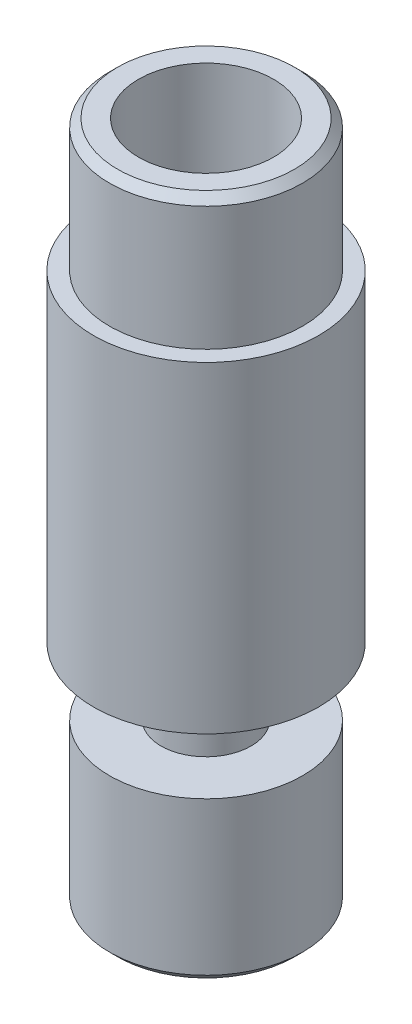
ISO-10303-21;
HEADER;
FILE_DESCRIPTION(('STEP AP214'),'2;1');
FILE_NAME('part.step','',(''),(''),'','','');
FILE_SCHEMA(('AUTOMOTIVE_DESIGN { 1 0 10303 214 1 1 1 1 }'));
ENDSEC;
DATA;
#1=APPLICATION_CONTEXT('core data for automotive mechanical design processes');
#2=APPLICATION_PROTOCOL_DEFINITION('international standard','automotive_design',2000,#1);
#3=PRODUCT_CONTEXT('',#1,'mechanical');
#4=PRODUCT('Part','Part','',(#3));
#5=PRODUCT_RELATED_PRODUCT_CATEGORY('part','',(#4));
#6=PRODUCT_DEFINITION_FORMATION('','',#4);
#7=PRODUCT_DEFINITION_CONTEXT('part definition',#1,'design');
#8=PRODUCT_DEFINITION('design','',#6,#7);
#9=PRODUCT_DEFINITION_SHAPE('','',#8);
#10=(LENGTH_UNIT() NAMED_UNIT(*) SI_UNIT(.MILLI.,.METRE.));
#11=(NAMED_UNIT(*) PLANE_ANGLE_UNIT() SI_UNIT($,.RADIAN.));
#12=(NAMED_UNIT(*) SI_UNIT($,.STERADIAN.) SOLID_ANGLE_UNIT());
#13=UNCERTAINTY_MEASURE_WITH_UNIT(LENGTH_MEASURE(1.E-05),#10,'distance_accuracy_value','');
#14=(GEOMETRIC_REPRESENTATION_CONTEXT(3) GLOBAL_UNCERTAINTY_ASSIGNED_CONTEXT((#13)) GLOBAL_UNIT_ASSIGNED_CONTEXT((#10,
#11,#12)) REPRESENTATION_CONTEXT('',''));
#15=CARTESIAN_POINT('',(0.,0.,0.));
#16=DIRECTION('',(0.,0.,1.));
#17=DIRECTION('',(1.,0.,0.));
#18=AXIS2_PLACEMENT_3D('',#15,#16,#17);
#19=CARTESIAN_POINT('',(0.,0.124999999999998,0.));
#20=DIRECTION('',(0.,1.,0.));
#21=DIRECTION('',(-1.,0.,0.));
#22=AXIS2_PLACEMENT_3D('',#19,#20,#21);
#23=CONICAL_SURFACE('',#22,2.875,0.78539816339747);
#24=CARTESIAN_POINT('',(0.,0.249999999999997,0.));
#25=DIRECTION('',(0.,-1.,0.));
#26=DIRECTION('',(-1.,0.,0.));
#27=AXIS2_PLACEMENT_3D('',#24,#25,#26);
#28=CIRCLE('',#27,3.);
#29=CARTESIAN_POINT('',(3.,0.249999999999997,0.));
#30=VERTEX_POINT('',#29);
#31=EDGE_CURVE('E11',#30,#30,#28,.T.);
#32=ORIENTED_EDGE('',*,*,#31,.T.);
#33=EDGE_LOOP('',(#32));
#34=FACE_BOUND('',#33,.T.);
#35=CARTESIAN_POINT('',(0.,0.,0.));
#36=DIRECTION('',(0.,1.,0.));
#37=DIRECTION('',(-1.,0.,0.));
#38=AXIS2_PLACEMENT_3D('',#35,#36,#37);
#39=CIRCLE('',#38,2.75);
#40=CARTESIAN_POINT('',(2.75,0.,0.));
#41=VERTEX_POINT('',#40);
#42=EDGE_CURVE('E27',#41,#41,#39,.T.);
#43=ORIENTED_EDGE('',*,*,#42,.T.);
#44=EDGE_LOOP('',(#43));
#45=FACE_BOUND('',#44,.T.);
#46=ADVANCED_FACE('F17',(#34,#45),#23,.T.);
#47=CARTESIAN_POINT('',(0.,2.5,0.));
#48=DIRECTION('',(0.,-1.,0.));
#49=DIRECTION('',(1.,0.,0.));
#50=AXIS2_PLACEMENT_3D('',#47,#48,#49);
#51=CYLINDRICAL_SURFACE('',#50,3.);
#52=CARTESIAN_POINT('',(0.,5.,0.));
#53=DIRECTION('',(0.,-1.,0.));
#54=DIRECTION('',(1.,0.,0.));
#55=AXIS2_PLACEMENT_3D('',#52,#53,#54);
#56=CIRCLE('',#55,3.);
#57=CARTESIAN_POINT('',(3.,5.,0.));
#58=VERTEX_POINT('',#57);
#59=EDGE_CURVE('E104',#58,#58,#56,.T.);
#60=ORIENTED_EDGE('',*,*,#59,.T.);
#61=EDGE_LOOP('',(#60));
#62=FACE_BOUND('',#61,.T.);
#63=ORIENTED_EDGE('',*,*,#31,.F.);
#64=EDGE_LOOP('',(#63));
#65=FACE_BOUND('',#64,.T.);
#66=ADVANCED_FACE('F113',(#62,#65),#51,.T.);
#67=CARTESIAN_POINT('',(0.,0.,0.));
#68=DIRECTION('',(0.,-1.,0.));
#69=DIRECTION('',(0.707106781186548,0.,0.707106781186548));
#70=AXIS2_PLACEMENT_3D('',#67,#68,#69);
#71=PLANE('',#70);
#72=CARTESIAN_POINT('',(0.,0.,0.));
#73=DIRECTION('',(0.,1.,0.));
#74=DIRECTION('',(1.,0.,0.));
#75=AXIS2_PLACEMENT_3D('',#72,#73,#74);
#76=CIRCLE('',#75,1.);
#77=CARTESIAN_POINT('',(-1.,0.,0.));
#78=VERTEX_POINT('',#77);
#79=EDGE_CURVE('E101',#78,#78,#76,.T.);
#80=ORIENTED_EDGE('',*,*,#79,.T.);
#81=EDGE_LOOP('',(#80));
#82=FACE_BOUND('',#81,.T.);
#83=ORIENTED_EDGE('',*,*,#42,.F.);
#84=EDGE_LOOP('',(#83));
#85=FACE_BOUND('',#84,.T.);
#86=ADVANCED_FACE('F110',(#82,#85),#71,.T.);
#87=CARTESIAN_POINT('',(0.,21.075,0.));
#88=DIRECTION('',(0.,-1.,0.));
#89=DIRECTION('',(-1.,0.,0.));
#90=AXIS2_PLACEMENT_3D('',#87,#88,#89);
#91=CONICAL_SURFACE('',#90,2.875,0.785398163397441);
#92=CARTESIAN_POINT('',(0.,21.2,0.));
#93=DIRECTION('',(0.,-1.,0.));
#94=DIRECTION('',(-1.,0.,0.));
#95=AXIS2_PLACEMENT_3D('',#92,#93,#94);
#96=CIRCLE('',#95,2.75);
#97=CARTESIAN_POINT('',(2.75,21.2,0.));
#98=VERTEX_POINT('',#97);
#99=EDGE_CURVE('E98',#98,#98,#96,.T.);
#100=ORIENTED_EDGE('',*,*,#99,.T.);
#101=EDGE_LOOP('',(#100));
#102=FACE_BOUND('',#101,.T.);
#103=CARTESIAN_POINT('',(0.,20.95,0.));
#104=DIRECTION('',(0.,1.,0.));
#105=DIRECTION('',(-1.,0.,0.));
#106=AXIS2_PLACEMENT_3D('',#103,#104,#105);
#107=CIRCLE('',#106,3.);
#108=CARTESIAN_POINT('',(3.,20.95,0.));
#109=VERTEX_POINT('',#108);
#110=EDGE_CURVE('E95',#109,#109,#107,.T.);
#111=ORIENTED_EDGE('',*,*,#110,.T.);
#112=EDGE_LOOP('',(#111));
#113=FACE_BOUND('',#112,.T.);
#114=ADVANCED_FACE('F112',(#102,#113),#91,.T.);
#115=CARTESIAN_POINT('',(3.,21.2,0.));
#116=DIRECTION('',(0.,1.,0.));
#117=DIRECTION('',(0.707106781186548,0.,0.707106781186548));
#118=AXIS2_PLACEMENT_3D('',#115,#116,#117);
#119=PLANE('',#118);
#120=CARTESIAN_POINT('',(0.,21.2,0.));
#121=DIRECTION('',(0.,-1.,0.));
#122=DIRECTION('',(-1.,0.,0.));
#123=AXIS2_PLACEMENT_3D('',#120,#121,#122);
#124=CIRCLE('',#123,2.1);
#125=CARTESIAN_POINT('',(-2.10000000000003,21.2,0.));
#126=VERTEX_POINT('',#125);
#127=EDGE_CURVE('E87',#126,#126,#124,.T.);
#128=ORIENTED_EDGE('',*,*,#127,.T.);
#129=EDGE_LOOP('',(#128));
#130=FACE_BOUND('',#129,.T.);
#131=ORIENTED_EDGE('',*,*,#99,.F.);
#132=EDGE_LOOP('',(#131));
#133=FACE_BOUND('',#132,.T.);
#134=ADVANCED_FACE('F121',(#130,#133),#119,.T.);
#135=CARTESIAN_POINT('',(0.,19.15,0.));
#136=DIRECTION('',(0.,-1.,0.));
#137=DIRECTION('',(1.,0.,0.));
#138=AXIS2_PLACEMENT_3D('',#135,#136,#137);
#139=CYLINDRICAL_SURFACE('',#138,3.);
#140=CARTESIAN_POINT('',(0.,17.1,0.));
#141=DIRECTION('',(0.,-1.,0.));
#142=DIRECTION('',(1.,0.,0.));
#143=AXIS2_PLACEMENT_3D('',#140,#141,#142);
#144=CIRCLE('',#143,3.);
#145=CARTESIAN_POINT('',(3.,17.1,0.));
#146=VERTEX_POINT('',#145);
#147=EDGE_CURVE('E83',#146,#146,#144,.T.);
#148=ORIENTED_EDGE('',*,*,#147,.F.);
#149=EDGE_LOOP('',(#148));
#150=FACE_BOUND('',#149,.T.);
#151=ORIENTED_EDGE('',*,*,#110,.F.);
#152=EDGE_LOOP('',(#151));
#153=FACE_BOUND('',#152,.T.);
#154=ADVANCED_FACE('F165',(#150,#153),#139,.T.);
#155=CARTESIAN_POINT('',(0.,15.5690963500211,0.));
#156=DIRECTION('',(0.,1.,0.));
#157=DIRECTION('',(-1.,0.,0.));
#158=AXIS2_PLACEMENT_3D('',#155,#156,#157);
#159=CONICAL_SURFACE('',#158,1.05,1.02974425867665);
#160=CARTESIAN_POINT('',(0.,15.5390533190697,0.));
#161=DIRECTION('',(0.,1.,0.));
#162=DIRECTION('',(1.,0.,0.));
#163=AXIS2_PLACEMENT_3D('',#160,#161,#162);
#164=CIRCLE('',#163,1.);
#165=CARTESIAN_POINT('',(-1.00000000000002,15.5390533190697,0.));
#166=VERTEX_POINT('',#165);
#167=EDGE_CURVE('E88',#166,#166,#164,.T.);
#168=ORIENTED_EDGE('',*,*,#167,.F.);
#169=EDGE_LOOP('',(#168));
#170=FACE_BOUND('',#169,.T.);
#171=CARTESIAN_POINT('',(0.,16.2,0.));
#172=DIRECTION('',(0.,1.,0.));
#173=DIRECTION('',(-1.,0.,0.));
#174=AXIS2_PLACEMENT_3D('',#171,#172,#173);
#175=CIRCLE('',#174,2.1);
#176=CARTESIAN_POINT('',(-2.1,16.2,0.));
#177=VERTEX_POINT('',#176);
#178=EDGE_CURVE('E84',#177,#177,#175,.T.);
#179=ORIENTED_EDGE('',*,*,#178,.T.);
#180=EDGE_LOOP('',(#179));
#181=FACE_BOUND('',#180,.T.);
#182=ADVANCED_FACE('F176',(#170,#181),#159,.F.);
#183=CARTESIAN_POINT('',(0.,18.7,0.));
#184=DIRECTION('',(0.,1.,0.));
#185=DIRECTION('',(-1.,0.,0.));
#186=AXIS2_PLACEMENT_3D('',#183,#184,#185);
#187=CYLINDRICAL_SURFACE('',#186,2.1);
#188=ORIENTED_EDGE('',*,*,#127,.F.);
#189=EDGE_LOOP('',(#188));
#190=FACE_BOUND('',#189,.T.);
#191=ORIENTED_EDGE('',*,*,#178,.F.);
#192=EDGE_LOOP('',(#191));
#193=FACE_BOUND('',#192,.T.);
#194=ADVANCED_FACE('F187',(#190,#193),#187,.F.);
#195=CARTESIAN_POINT('',(0.,-2.19743575693714,0.));
#196=DIRECTION('',(0.,1.,0.));
#197=DIRECTION('',(1.,0.,0.));
#198=AXIS2_PLACEMENT_3D('',#195,#196,#197);
#199=CYLINDRICAL_SURFACE('',#198,1.);
#200=ORIENTED_EDGE('',*,*,#167,.T.);
#201=EDGE_LOOP('',(#200));
#202=FACE_BOUND('',#201,.T.);
#203=ORIENTED_EDGE('',*,*,#79,.F.);
#204=EDGE_LOOP('',(#203));
#205=FACE_BOUND('',#204,.T.);
#206=ADVANCED_FACE('F198',(#202,#205),#199,.F.);
#207=CARTESIAN_POINT('',(3.5,17.1,0.));
#208=DIRECTION('',(0.,1.,0.));
#209=DIRECTION('',(0.707106781186548,0.,0.707106781186548));
#210=AXIS2_PLACEMENT_3D('',#207,#208,#209);
#211=PLANE('',#210);
#212=ORIENTED_EDGE('',*,*,#147,.T.);
#213=EDGE_LOOP('',(#212));
#214=FACE_BOUND('',#213,.T.);
#215=CARTESIAN_POINT('',(0.,17.1,0.));
#216=DIRECTION('',(0.,-1.,0.));
#217=DIRECTION('',(1.,0.,0.));
#218=AXIS2_PLACEMENT_3D('',#215,#216,#217);
#219=CIRCLE('',#218,3.5);
#220=CARTESIAN_POINT('',(3.5,17.1,0.));
#221=VERTEX_POINT('',#220);
#222=EDGE_CURVE('E78',#221,#221,#219,.T.);
#223=ORIENTED_EDGE('',*,*,#222,.F.);
#224=EDGE_LOOP('',(#223));
#225=FACE_BOUND('',#224,.T.);
#226=ADVANCED_FACE('F209',(#214,#225),#211,.T.);
#227=CARTESIAN_POINT('',(0.,12.1,0.));
#228=DIRECTION('',(0.,-1.,0.));
#229=DIRECTION('',(1.,0.,0.));
#230=AXIS2_PLACEMENT_3D('',#227,#228,#229);
#231=CYLINDRICAL_SURFACE('',#230,3.5);
#232=ORIENTED_EDGE('',*,*,#222,.T.);
#233=EDGE_LOOP('',(#232));
#234=FACE_BOUND('',#233,.T.);
#235=CARTESIAN_POINT('',(0.,7.1,0.));
#236=DIRECTION('',(0.,-1.,0.));
#237=DIRECTION('',(1.,0.,0.));
#238=AXIS2_PLACEMENT_3D('',#235,#236,#237);
#239=CIRCLE('',#238,3.5);
#240=CARTESIAN_POINT('',(3.5,7.1,0.));
#241=VERTEX_POINT('',#240);
#242=EDGE_CURVE('E75',#241,#241,#239,.T.);
#243=ORIENTED_EDGE('',*,*,#242,.F.);
#244=EDGE_LOOP('',(#243));
#245=FACE_BOUND('',#244,.T.);
#246=ADVANCED_FACE('F220',(#234,#245),#231,.T.);
#247=CARTESIAN_POINT('',(1.4,7.1,0.));
#248=DIRECTION('',(0.,-1.,0.));
#249=DIRECTION('',(0.707106781186548,0.,0.707106781186548));
#250=AXIS2_PLACEMENT_3D('',#247,#248,#249);
#251=PLANE('',#250);
#252=ORIENTED_EDGE('',*,*,#242,.T.);
#253=EDGE_LOOP('',(#252));
#254=FACE_BOUND('',#253,.T.);
#255=CARTESIAN_POINT('',(0.,7.1,0.));
#256=DIRECTION('',(0.,-1.,0.));
#257=DIRECTION('',(1.,0.,0.));
#258=AXIS2_PLACEMENT_3D('',#255,#256,#257);
#259=CIRCLE('',#258,1.4);
#260=CARTESIAN_POINT('',(1.4,7.1,0.));
#261=VERTEX_POINT('',#260);
#262=EDGE_CURVE('E69',#261,#261,#259,.T.);
#263=ORIENTED_EDGE('',*,*,#262,.F.);
#264=EDGE_LOOP('',(#263));
#265=FACE_BOUND('',#264,.T.);
#266=ADVANCED_FACE('F231',(#254,#265),#251,.T.);
#267=CARTESIAN_POINT('',(0.,6.05,0.));
#268=DIRECTION('',(0.,-1.,0.));
#269=DIRECTION('',(1.,0.,0.));
#270=AXIS2_PLACEMENT_3D('',#267,#268,#269);
#271=CYLINDRICAL_SURFACE('',#270,1.4);
#272=ORIENTED_EDGE('',*,*,#262,.T.);
#273=EDGE_LOOP('',(#272));
#274=FACE_BOUND('',#273,.T.);
#275=CARTESIAN_POINT('',(0.,5.,0.));
#276=DIRECTION('',(0.,-1.,0.));
#277=DIRECTION('',(1.,0.,0.));
#278=AXIS2_PLACEMENT_3D('',#275,#276,#277);
#279=CIRCLE('',#278,1.4);
#280=CARTESIAN_POINT('',(1.4,5.,0.));
#281=VERTEX_POINT('',#280);
#282=EDGE_CURVE('E21',#281,#281,#279,.T.);
#283=ORIENTED_EDGE('',*,*,#282,.F.);
#284=EDGE_LOOP('',(#283));
#285=FACE_BOUND('',#284,.T.);
#286=ADVANCED_FACE('F73',(#274,#285),#271,.T.);
#287=CARTESIAN_POINT('',(3.,5.,0.));
#288=DIRECTION('',(0.,1.,0.));
#289=DIRECTION('',(0.707106781186548,0.,0.707106781186548));
#290=AXIS2_PLACEMENT_3D('',#287,#288,#289);
#291=PLANE('',#290);
#292=ORIENTED_EDGE('',*,*,#282,.T.);
#293=EDGE_LOOP('',(#292));
#294=FACE_BOUND('',#293,.T.);
#295=ORIENTED_EDGE('',*,*,#59,.F.);
#296=EDGE_LOOP('',(#295));
#297=FACE_BOUND('',#296,.T.);
#298=ADVANCED_FACE('F19',(#294,#297),#291,.T.);
#299=CLOSED_SHELL('',(#46,#66,#86,#114,#134,#154,#182,#194,#206,#226,#246,#266,#286,#298));
#300=MANIFOLD_SOLID_BREP('B1',#299);
#301=ADVANCED_BREP_SHAPE_REPRESENTATION('',(#18,#300),#14);
#302=SHAPE_DEFINITION_REPRESENTATION(#9,#301);
ENDSEC;
END-ISO-10303-21;
